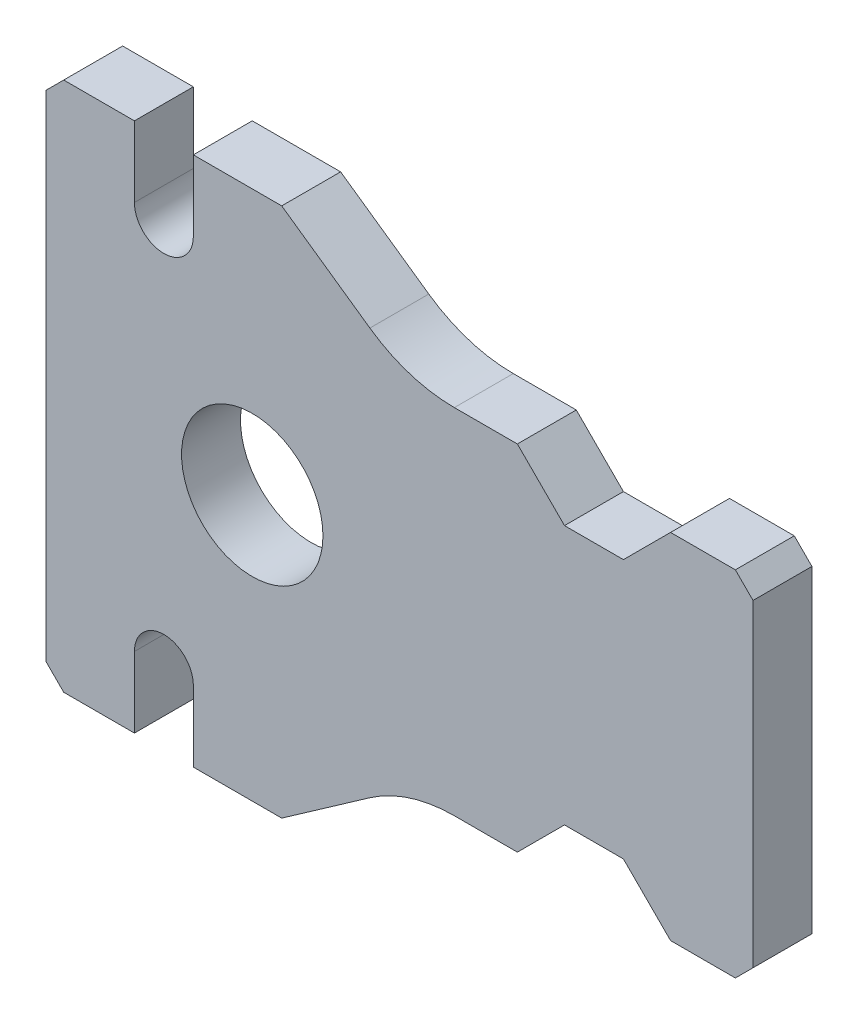
ISO-10303-21;
HEADER;
FILE_DESCRIPTION(('STEP AP214'),'2;1');
FILE_NAME('part.step','',(''),(''),'','','');
FILE_SCHEMA(('AUTOMOTIVE_DESIGN { 1 0 10303 214 1 1 1 1 }'));
ENDSEC;
DATA;
#1=APPLICATION_CONTEXT('core data for automotive mechanical design processes');
#2=APPLICATION_PROTOCOL_DEFINITION('international standard','automotive_design',2000,#1);
#3=PRODUCT_CONTEXT('',#1,'mechanical');
#4=PRODUCT('Part','Part','',(#3));
#5=PRODUCT_RELATED_PRODUCT_CATEGORY('part','',(#4));
#6=PRODUCT_DEFINITION_FORMATION('','',#4);
#7=PRODUCT_DEFINITION_CONTEXT('part definition',#1,'design');
#8=PRODUCT_DEFINITION('design','',#6,#7);
#9=PRODUCT_DEFINITION_SHAPE('','',#8);
#10=(LENGTH_UNIT() NAMED_UNIT(*) SI_UNIT(.MILLI.,.METRE.));
#11=(NAMED_UNIT(*) PLANE_ANGLE_UNIT() SI_UNIT($,.RADIAN.));
#12=(NAMED_UNIT(*) SI_UNIT($,.STERADIAN.) SOLID_ANGLE_UNIT());
#13=UNCERTAINTY_MEASURE_WITH_UNIT(LENGTH_MEASURE(1.E-05),#10,'distance_accuracy_value','');
#14=(GEOMETRIC_REPRESENTATION_CONTEXT(3) GLOBAL_UNCERTAINTY_ASSIGNED_CONTEXT((#13)) GLOBAL_UNIT_ASSIGNED_CONTEXT((#10,
#11,#12)) REPRESENTATION_CONTEXT('',''));
#15=CARTESIAN_POINT('',(0.,0.,0.));
#16=DIRECTION('',(0.,0.,1.));
#17=DIRECTION('',(1.,0.,0.));
#18=AXIS2_PLACEMENT_3D('',#15,#16,#17);
#19=CARTESIAN_POINT('',(-15.,-33.,10.));
#20=DIRECTION('',(0.,0.,1.));
#21=DIRECTION('',(1.,0.,0.));
#22=AXIS2_PLACEMENT_3D('',#19,#20,#21);
#23=PLANE('',#22);
#24=DIRECTION('',(1.,0.,0.));
#25=VECTOR('',#24,1.);
#26=CARTESIAN_POINT('',(85.,-30.,10.));
#27=LINE('',#26,#25);
#28=CARTESIAN_POINT('',(71.,-30.,10.));
#29=VERTEX_POINT('',#28);
#30=CARTESIAN_POINT('',(81.9999999999999,-30.,10.));
#31=VERTEX_POINT('',#30);
#32=EDGE_CURVE('E275',#29,#31,#27,.T.);
#33=ORIENTED_EDGE('',*,*,#32,.T.);
#34=DIRECTION('',(-0.707106781186551,-0.707106781186544,0.));
#35=VECTOR('',#34,1.);
#36=CARTESIAN_POINT('',(31.9999999999995,-80.,10.));
#37=LINE('',#36,#35);
#38=CARTESIAN_POINT('',(85.,-27.,10.));
#39=VERTEX_POINT('',#38);
#40=EDGE_CURVE('E41',#31,#39,#37,.F.);
#41=ORIENTED_EDGE('',*,*,#40,.T.);
#42=DIRECTION('',(0.,1.,0.));
#43=VECTOR('',#42,1.);
#44=CARTESIAN_POINT('',(85.,30.,10.));
#45=LINE('',#44,#43);
#46=CARTESIAN_POINT('',(85.,27.,10.));
#47=VERTEX_POINT('',#46);
#48=EDGE_CURVE('E274',#39,#47,#45,.T.);
#49=ORIENTED_EDGE('',*,*,#48,.T.);
#50=DIRECTION('',(0.707106781186544,-0.707106781186551,0.));
#51=VECTOR('',#50,1.);
#52=CARTESIAN_POINT('',(65.0000000000004,46.9999999999997,10.));
#53=LINE('',#52,#51);
#54=CARTESIAN_POINT('',(82.,30.,10.));
#55=VERTEX_POINT('',#54);
#56=EDGE_CURVE('E48',#47,#55,#53,.F.);
#57=ORIENTED_EDGE('',*,*,#56,.T.);
#58=DIRECTION('',(-1.,0.,0.));
#59=VECTOR('',#58,1.);
#60=CARTESIAN_POINT('',(85.,30.,10.));
#61=LINE('',#60,#59);
#62=CARTESIAN_POINT('',(71.,30.,10.));
#63=VERTEX_POINT('',#62);
#64=EDGE_CURVE('E283',#55,#63,#61,.T.);
#65=ORIENTED_EDGE('',*,*,#64,.T.);
#66=DIRECTION('',(-0.707106781186548,-0.707106781186547,0.));
#67=VECTOR('',#66,1.);
#68=CARTESIAN_POINT('',(63.,22.,10.));
#69=LINE('',#68,#67);
#70=CARTESIAN_POINT('',(63.,22.,10.));
#71=VERTEX_POINT('',#70);
#72=EDGE_CURVE('E445',#63,#71,#69,.T.);
#73=ORIENTED_EDGE('',*,*,#72,.T.);
#74=DIRECTION('',(-1.,0.,0.));
#75=VECTOR('',#74,1.);
#76=CARTESIAN_POINT('',(63.,22.,10.));
#77=LINE('',#76,#75);
#78=CARTESIAN_POINT('',(53.,22.,10.));
#79=VERTEX_POINT('',#78);
#80=EDGE_CURVE('E447',#71,#79,#77,.T.);
#81=ORIENTED_EDGE('',*,*,#80,.T.);
#82=DIRECTION('',(-0.707106781186548,0.707106781186548,0.));
#83=VECTOR('',#82,1.);
#84=CARTESIAN_POINT('',(53.,22.,10.));
#85=LINE('',#84,#83);
#86=CARTESIAN_POINT('',(45.,30.,10.));
#87=VERTEX_POINT('',#86);
#88=EDGE_CURVE('E449',#79,#87,#85,.T.);
#89=ORIENTED_EDGE('',*,*,#88,.T.);
#90=DIRECTION('',(-1.,0.,0.));
#91=VECTOR('',#90,1.);
#92=CARTESIAN_POINT('',(45.,30.,10.));
#93=LINE('',#92,#91);
#94=CARTESIAN_POINT('',(34.3046898231063,30.,10.));
#95=VERTEX_POINT('',#94);
#96=EDGE_CURVE('E451',#87,#95,#93,.T.);
#97=ORIENTED_EDGE('',*,*,#96,.T.);
#98=CARTESIAN_POINT('',(34.3046898231063,55.,10.));
#99=DIRECTION('',(0.,0.,-1.));
#100=DIRECTION('',(-1.,0.,0.));
#101=AXIS2_PLACEMENT_3D('',#98,#99,#100);
#102=CIRCLE('',#101,25.);
#103=CARTESIAN_POINT('',(19.96527891433,34.5211988927753,10.));
#104=VERTEX_POINT('',#103);
#105=EDGE_CURVE('E453',#95,#104,#102,.T.);
#106=ORIENTED_EDGE('',*,*,#105,.T.);
#107=DIRECTION('',(-0.819152044288991,0.573576436351047,0.));
#108=VECTOR('',#107,1.);
#109=CARTESIAN_POINT('',(5.,45.,10.));
#110=LINE('',#109,#108);
#111=CARTESIAN_POINT('',(5.,45.,10.));
#112=VERTEX_POINT('',#111);
#113=EDGE_CURVE('E455',#104,#112,#110,.T.);
#114=ORIENTED_EDGE('',*,*,#113,.T.);
#115=DIRECTION('',(-1.,0.,0.));
#116=VECTOR('',#115,1.);
#117=CARTESIAN_POINT('',(-10.,45.,10.));
#118=LINE('',#117,#116);
#119=CARTESIAN_POINT('',(-10.,45.,10.));
#120=VERTEX_POINT('',#119);
#121=EDGE_CURVE('E457',#112,#120,#118,.T.);
#122=ORIENTED_EDGE('',*,*,#121,.T.);
#123=DIRECTION('',(0.,-1.,0.));
#124=VECTOR('',#123,1.);
#125=CARTESIAN_POINT('',(-10.,33.,10.));
#126=LINE('',#125,#124);
#127=CARTESIAN_POINT('',(-10.,33.,10.));
#128=VERTEX_POINT('',#127);
#129=EDGE_CURVE('E459',#120,#128,#126,.T.);
#130=ORIENTED_EDGE('',*,*,#129,.T.);
#131=CARTESIAN_POINT('',(-15.,33.,10.));
#132=DIRECTION('',(0.,0.,-1.));
#133=DIRECTION('',(-1.,0.,0.));
#134=AXIS2_PLACEMENT_3D('',#131,#132,#133);
#135=CIRCLE('',#134,5.);
#136=CARTESIAN_POINT('',(-20.,33.,10.));
#137=VERTEX_POINT('',#136);
#138=EDGE_CURVE('E461',#128,#137,#135,.T.);
#139=ORIENTED_EDGE('',*,*,#138,.T.);
#140=DIRECTION('',(0.,1.,0.));
#141=VECTOR('',#140,1.);
#142=CARTESIAN_POINT('',(-20.,45.,10.));
#143=LINE('',#142,#141);
#144=CARTESIAN_POINT('',(-20.,45.,10.));
#145=VERTEX_POINT('',#144);
#146=EDGE_CURVE('E463',#137,#145,#143,.T.);
#147=ORIENTED_EDGE('',*,*,#146,.T.);
#148=DIRECTION('',(-1.,0.,0.));
#149=VECTOR('',#148,1.);
#150=CARTESIAN_POINT('',(-32.,45.,10.));
#151=LINE('',#150,#149);
#152=CARTESIAN_POINT('',(-32.,45.,10.));
#153=VERTEX_POINT('',#152);
#154=EDGE_CURVE('E465',#145,#153,#151,.T.);
#155=ORIENTED_EDGE('',*,*,#154,.T.);
#156=DIRECTION('',(-0.707106781186547,-0.707106781186547,0.));
#157=VECTOR('',#156,1.);
#158=CARTESIAN_POINT('',(-35.,42.,10.));
#159=LINE('',#158,#157);
#160=CARTESIAN_POINT('',(-35.,42.,10.));
#161=VERTEX_POINT('',#160);
#162=EDGE_CURVE('E467',#153,#161,#159,.T.);
#163=ORIENTED_EDGE('',*,*,#162,.T.);
#164=DIRECTION('',(0.,-1.,0.));
#165=VECTOR('',#164,1.);
#166=CARTESIAN_POINT('',(-35.,42.,10.));
#167=LINE('',#166,#165);
#168=CARTESIAN_POINT('',(-35.,-42.,10.));
#169=VERTEX_POINT('',#168);
#170=EDGE_CURVE('E469',#161,#169,#167,.T.);
#171=ORIENTED_EDGE('',*,*,#170,.T.);
#172=DIRECTION('',(0.707106781186547,-0.707106781186547,0.));
#173=VECTOR('',#172,1.);
#174=CARTESIAN_POINT('',(-35.,-42.,10.));
#175=LINE('',#174,#173);
#176=CARTESIAN_POINT('',(-32.,-45.,10.));
#177=VERTEX_POINT('',#176);
#178=EDGE_CURVE('E471',#169,#177,#175,.T.);
#179=ORIENTED_EDGE('',*,*,#178,.T.);
#180=DIRECTION('',(1.,0.,0.));
#181=VECTOR('',#180,1.);
#182=CARTESIAN_POINT('',(-32.,-45.,10.));
#183=LINE('',#182,#181);
#184=CARTESIAN_POINT('',(-20.,-45.,10.));
#185=VERTEX_POINT('',#184);
#186=EDGE_CURVE('E248',#177,#185,#183,.T.);
#187=ORIENTED_EDGE('',*,*,#186,.T.);
#188=DIRECTION('',(0.,1.,0.));
#189=VECTOR('',#188,1.);
#190=CARTESIAN_POINT('',(-20.,-45.,10.));
#191=LINE('',#190,#189);
#192=CARTESIAN_POINT('',(-20.,-33.,10.));
#193=VERTEX_POINT('',#192);
#194=EDGE_CURVE('E243',#185,#193,#191,.T.);
#195=ORIENTED_EDGE('',*,*,#194,.T.);
#196=CARTESIAN_POINT('',(-15.,-33.,10.));
#197=DIRECTION('',(0.,0.,-1.));
#198=DIRECTION('',(1.,0.,0.));
#199=AXIS2_PLACEMENT_3D('',#196,#197,#198);
#200=CIRCLE('',#199,5.);
#201=CARTESIAN_POINT('',(-10.,-33.,10.));
#202=VERTEX_POINT('',#201);
#203=EDGE_CURVE('E233',#193,#202,#200,.T.);
#204=ORIENTED_EDGE('',*,*,#203,.T.);
#205=DIRECTION('',(0.,-1.,0.));
#206=VECTOR('',#205,1.);
#207=CARTESIAN_POINT('',(-10.,-33.,10.));
#208=LINE('',#207,#206);
#209=CARTESIAN_POINT('',(-10.,-45.,10.));
#210=VERTEX_POINT('',#209);
#211=EDGE_CURVE('E242',#202,#210,#208,.T.);
#212=ORIENTED_EDGE('',*,*,#211,.T.);
#213=DIRECTION('',(1.,0.,0.));
#214=VECTOR('',#213,1.);
#215=CARTESIAN_POINT('',(-10.,-45.,10.));
#216=LINE('',#215,#214);
#217=CARTESIAN_POINT('',(5.,-45.,10.));
#218=VERTEX_POINT('',#217);
#219=EDGE_CURVE('E408',#210,#218,#216,.T.);
#220=ORIENTED_EDGE('',*,*,#219,.T.);
#221=DIRECTION('',(0.819152044288991,0.573576436351047,0.));
#222=VECTOR('',#221,1.);
#223=CARTESIAN_POINT('',(5.,-45.,10.));
#224=LINE('',#223,#222);
#225=CARTESIAN_POINT('',(19.96527891433,-34.5211988927753,10.));
#226=VERTEX_POINT('',#225);
#227=EDGE_CURVE('E477',#218,#226,#224,.T.);
#228=ORIENTED_EDGE('',*,*,#227,.T.);
#229=CARTESIAN_POINT('',(34.3046898231063,-55.,10.));
#230=DIRECTION('',(0.,0.,-1.));
#231=DIRECTION('',(1.,0.,0.));
#232=AXIS2_PLACEMENT_3D('',#229,#230,#231);
#233=CIRCLE('',#232,25.);
#234=CARTESIAN_POINT('',(34.3046898231063,-30.,10.));
#235=VERTEX_POINT('',#234);
#236=EDGE_CURVE('E481',#226,#235,#233,.T.);
#237=ORIENTED_EDGE('',*,*,#236,.T.);
#238=DIRECTION('',(1.,0.,0.));
#239=VECTOR('',#238,1.);
#240=CARTESIAN_POINT('',(45.,-30.,10.));
#241=LINE('',#240,#239);
#242=CARTESIAN_POINT('',(45.,-30.,10.));
#243=VERTEX_POINT('',#242);
#244=EDGE_CURVE('E483',#235,#243,#241,.T.);
#245=ORIENTED_EDGE('',*,*,#244,.T.);
#246=DIRECTION('',(0.707106781186548,0.707106781186548,0.));
#247=VECTOR('',#246,1.);
#248=CARTESIAN_POINT('',(53.,-22.,10.));
#249=LINE('',#248,#247);
#250=CARTESIAN_POINT('',(53.,-22.,10.));
#251=VERTEX_POINT('',#250);
#252=EDGE_CURVE('E440',#243,#251,#249,.T.);
#253=ORIENTED_EDGE('',*,*,#252,.T.);
#254=DIRECTION('',(1.,0.,0.));
#255=VECTOR('',#254,1.);
#256=CARTESIAN_POINT('',(63.,-22.,10.));
#257=LINE('',#256,#255);
#258=CARTESIAN_POINT('',(63.,-22.,10.));
#259=VERTEX_POINT('',#258);
#260=EDGE_CURVE('E437',#251,#259,#257,.T.);
#261=ORIENTED_EDGE('',*,*,#260,.T.);
#262=DIRECTION('',(0.707106781186548,-0.707106781186547,0.));
#263=VECTOR('',#262,1.);
#264=CARTESIAN_POINT('',(63.,-22.,10.));
#265=LINE('',#264,#263);
#266=EDGE_CURVE('E436',#259,#29,#265,.T.);
#267=ORIENTED_EDGE('',*,*,#266,.T.);
#268=EDGE_LOOP('',(#33,#41,#49,#57,#65,#73,#81,#89,#97,#106,#114,#122,#130,#139,#147,#155,#163,
#171,#179,#187,#195,#204,#212,#220,#228,#237,#245,#253,#261,#267));
#269=FACE_BOUND('',#268,.T.);
#270=CARTESIAN_POINT('',(0.,0.,10.));
#271=DIRECTION('',(0.,0.,1.));
#272=DIRECTION('',(1.,0.,0.));
#273=AXIS2_PLACEMENT_3D('',#270,#271,#272);
#274=CIRCLE('',#273,12.);
#275=CARTESIAN_POINT('',(12.,0.,10.));
#276=VERTEX_POINT('',#275);
#277=EDGE_CURVE('E474',#276,#276,#274,.T.);
#278=ORIENTED_EDGE('',*,*,#277,.F.);
#279=EDGE_LOOP('',(#278));
#280=FACE_BOUND('',#279,.T.);
#281=ADVANCED_FACE('F33',(#269,#280),#23,.T.);
#282=CARTESIAN_POINT('',(-15.,-33.,0.));
#283=DIRECTION('',(0.,0.,1.));
#284=DIRECTION('',(1.,0.,0.));
#285=AXIS2_PLACEMENT_3D('',#282,#283,#284);
#286=PLANE('',#285);
#287=DIRECTION('',(0.,1.,0.));
#288=VECTOR('',#287,1.);
#289=CARTESIAN_POINT('',(85.,30.,0.));
#290=LINE('',#289,#288);
#291=CARTESIAN_POINT('',(85.,-27.,0.));
#292=VERTEX_POINT('',#291);
#293=CARTESIAN_POINT('',(85.,27.,0.));
#294=VERTEX_POINT('',#293);
#295=EDGE_CURVE('E292',#292,#294,#290,.T.);
#296=ORIENTED_EDGE('',*,*,#295,.F.);
#297=DIRECTION('',(0.707106781186551,0.707106781186544,0.));
#298=VECTOR('',#297,1.);
#299=CARTESIAN_POINT('',(85.,-27.,0.));
#300=LINE('',#299,#298);
#301=CARTESIAN_POINT('',(81.9999999999999,-30.,0.));
#302=VERTEX_POINT('',#301);
#303=EDGE_CURVE('E269',#292,#302,#300,.F.);
#304=ORIENTED_EDGE('',*,*,#303,.T.);
#305=DIRECTION('',(1.,0.,0.));
#306=VECTOR('',#305,1.);
#307=CARTESIAN_POINT('',(85.,-30.,0.));
#308=LINE('',#307,#306);
#309=CARTESIAN_POINT('',(71.,-30.,0.));
#310=VERTEX_POINT('',#309);
#311=EDGE_CURVE('E291',#310,#302,#308,.T.);
#312=ORIENTED_EDGE('',*,*,#311,.F.);
#313=DIRECTION('',(0.707106781186548,-0.707106781186547,0.));
#314=VECTOR('',#313,1.);
#315=CARTESIAN_POINT('',(63.,-22.,0.));
#316=LINE('',#315,#314);
#317=CARTESIAN_POINT('',(63.,-22.,0.));
#318=VERTEX_POINT('',#317);
#319=EDGE_CURVE('E297',#318,#310,#316,.T.);
#320=ORIENTED_EDGE('',*,*,#319,.F.);
#321=DIRECTION('',(1.,0.,0.));
#322=VECTOR('',#321,1.);
#323=CARTESIAN_POINT('',(63.,-22.,0.));
#324=LINE('',#323,#322);
#325=CARTESIAN_POINT('',(53.,-22.,0.));
#326=VERTEX_POINT('',#325);
#327=EDGE_CURVE('E301',#326,#318,#324,.T.);
#328=ORIENTED_EDGE('',*,*,#327,.F.);
#329=DIRECTION('',(0.707106781186548,0.707106781186548,0.));
#330=VECTOR('',#329,1.);
#331=CARTESIAN_POINT('',(53.,-22.,0.));
#332=LINE('',#331,#330);
#333=CARTESIAN_POINT('',(45.,-30.,0.));
#334=VERTEX_POINT('',#333);
#335=EDGE_CURVE('E425',#334,#326,#332,.T.);
#336=ORIENTED_EDGE('',*,*,#335,.F.);
#337=DIRECTION('',(1.,0.,0.));
#338=VECTOR('',#337,1.);
#339=CARTESIAN_POINT('',(45.,-30.,0.));
#340=LINE('',#339,#338);
#341=CARTESIAN_POINT('',(34.3046898231063,-30.,0.));
#342=VERTEX_POINT('',#341);
#343=EDGE_CURVE('E423',#342,#334,#340,.T.);
#344=ORIENTED_EDGE('',*,*,#343,.F.);
#345=CARTESIAN_POINT('',(34.3046898231063,-55.,0.));
#346=DIRECTION('',(0.,0.,-1.));
#347=DIRECTION('',(1.,0.,0.));
#348=AXIS2_PLACEMENT_3D('',#345,#346,#347);
#349=CIRCLE('',#348,25.);
#350=CARTESIAN_POINT('',(19.96527891433,-34.5211988927753,0.));
#351=VERTEX_POINT('',#350);
#352=EDGE_CURVE('E416',#351,#342,#349,.T.);
#353=ORIENTED_EDGE('',*,*,#352,.F.);
#354=DIRECTION('',(0.819152044288991,0.573576436351047,0.));
#355=VECTOR('',#354,1.);
#356=CARTESIAN_POINT('',(5.,-45.,0.));
#357=LINE('',#356,#355);
#358=CARTESIAN_POINT('',(5.,-45.,0.));
#359=VERTEX_POINT('',#358);
#360=EDGE_CURVE('E414',#359,#351,#357,.T.);
#361=ORIENTED_EDGE('',*,*,#360,.F.);
#362=DIRECTION('',(1.,0.,0.));
#363=VECTOR('',#362,1.);
#364=CARTESIAN_POINT('',(-10.,-45.,0.));
#365=LINE('',#364,#363);
#366=CARTESIAN_POINT('',(-10.,-45.,0.));
#367=VERTEX_POINT('',#366);
#368=EDGE_CURVE('E407',#367,#359,#365,.T.);
#369=ORIENTED_EDGE('',*,*,#368,.F.);
#370=DIRECTION('',(0.,-1.,0.));
#371=VECTOR('',#370,1.);
#372=CARTESIAN_POINT('',(-10.,-33.,0.));
#373=LINE('',#372,#371);
#374=CARTESIAN_POINT('',(-10.,-33.,0.));
#375=VERTEX_POINT('',#374);
#376=EDGE_CURVE('E412',#375,#367,#373,.T.);
#377=ORIENTED_EDGE('',*,*,#376,.F.);
#378=CARTESIAN_POINT('',(-15.,-33.,0.));
#379=DIRECTION('',(0.,0.,-1.));
#380=DIRECTION('',(1.,0.,0.));
#381=AXIS2_PLACEMENT_3D('',#378,#379,#380);
#382=CIRCLE('',#381,5.);
#383=CARTESIAN_POINT('',(-20.,-33.,0.));
#384=VERTEX_POINT('',#383);
#385=EDGE_CURVE('E418',#384,#375,#382,.T.);
#386=ORIENTED_EDGE('',*,*,#385,.F.);
#387=DIRECTION('',(0.,1.,0.));
#388=VECTOR('',#387,1.);
#389=CARTESIAN_POINT('',(-20.,-45.,0.));
#390=LINE('',#389,#388);
#391=CARTESIAN_POINT('',(-20.,-45.,0.));
#392=VERTEX_POINT('',#391);
#393=EDGE_CURVE('E256',#392,#384,#390,.T.);
#394=ORIENTED_EDGE('',*,*,#393,.F.);
#395=DIRECTION('',(1.,0.,0.));
#396=VECTOR('',#395,1.);
#397=CARTESIAN_POINT('',(-32.,-45.,0.));
#398=LINE('',#397,#396);
#399=CARTESIAN_POINT('',(-32.,-45.,0.));
#400=VERTEX_POINT('',#399);
#401=EDGE_CURVE('E252',#400,#392,#398,.T.);
#402=ORIENTED_EDGE('',*,*,#401,.F.);
#403=DIRECTION('',(0.707106781186547,-0.707106781186547,0.));
#404=VECTOR('',#403,1.);
#405=CARTESIAN_POINT('',(-35.,-42.,0.));
#406=LINE('',#405,#404);
#407=CARTESIAN_POINT('',(-35.,-42.,0.));
#408=VERTEX_POINT('',#407);
#409=EDGE_CURVE('E332',#408,#400,#406,.T.);
#410=ORIENTED_EDGE('',*,*,#409,.F.);
#411=DIRECTION('',(0.,-1.,0.));
#412=VECTOR('',#411,1.);
#413=CARTESIAN_POINT('',(-35.,42.,0.));
#414=LINE('',#413,#412);
#415=CARTESIAN_POINT('',(-35.,42.,0.));
#416=VERTEX_POINT('',#415);
#417=EDGE_CURVE('E330',#416,#408,#414,.T.);
#418=ORIENTED_EDGE('',*,*,#417,.F.);
#419=DIRECTION('',(-0.707106781186547,-0.707106781186547,0.));
#420=VECTOR('',#419,1.);
#421=CARTESIAN_POINT('',(-35.,42.,0.));
#422=LINE('',#421,#420);
#423=CARTESIAN_POINT('',(-32.,45.,0.));
#424=VERTEX_POINT('',#423);
#425=EDGE_CURVE('E328',#424,#416,#422,.T.);
#426=ORIENTED_EDGE('',*,*,#425,.F.);
#427=DIRECTION('',(-1.,0.,0.));
#428=VECTOR('',#427,1.);
#429=CARTESIAN_POINT('',(-32.,45.,0.));
#430=LINE('',#429,#428);
#431=CARTESIAN_POINT('',(-20.,45.,0.));
#432=VERTEX_POINT('',#431);
#433=EDGE_CURVE('E326',#432,#424,#430,.T.);
#434=ORIENTED_EDGE('',*,*,#433,.F.);
#435=DIRECTION('',(0.,1.,0.));
#436=VECTOR('',#435,1.);
#437=CARTESIAN_POINT('',(-20.,45.,0.));
#438=LINE('',#437,#436);
#439=CARTESIAN_POINT('',(-20.,33.,0.));
#440=VERTEX_POINT('',#439);
#441=EDGE_CURVE('E324',#440,#432,#438,.T.);
#442=ORIENTED_EDGE('',*,*,#441,.F.);
#443=CARTESIAN_POINT('',(-15.,33.,0.));
#444=DIRECTION('',(0.,0.,-1.));
#445=DIRECTION('',(-1.,0.,0.));
#446=AXIS2_PLACEMENT_3D('',#443,#444,#445);
#447=CIRCLE('',#446,5.);
#448=CARTESIAN_POINT('',(-10.,33.,0.));
#449=VERTEX_POINT('',#448);
#450=EDGE_CURVE('E322',#449,#440,#447,.T.);
#451=ORIENTED_EDGE('',*,*,#450,.F.);
#452=DIRECTION('',(0.,-1.,0.));
#453=VECTOR('',#452,1.);
#454=CARTESIAN_POINT('',(-10.,33.,0.));
#455=LINE('',#454,#453);
#456=CARTESIAN_POINT('',(-10.,45.,0.));
#457=VERTEX_POINT('',#456);
#458=EDGE_CURVE('E320',#457,#449,#455,.T.);
#459=ORIENTED_EDGE('',*,*,#458,.F.);
#460=DIRECTION('',(-1.,0.,0.));
#461=VECTOR('',#460,1.);
#462=CARTESIAN_POINT('',(-10.,45.,0.));
#463=LINE('',#462,#461);
#464=CARTESIAN_POINT('',(5.,45.,0.));
#465=VERTEX_POINT('',#464);
#466=EDGE_CURVE('E318',#465,#457,#463,.T.);
#467=ORIENTED_EDGE('',*,*,#466,.F.);
#468=DIRECTION('',(-0.819152044288991,0.573576436351047,0.));
#469=VECTOR('',#468,1.);
#470=CARTESIAN_POINT('',(5.,45.,0.));
#471=LINE('',#470,#469);
#472=CARTESIAN_POINT('',(19.96527891433,34.5211988927753,0.));
#473=VERTEX_POINT('',#472);
#474=EDGE_CURVE('E316',#473,#465,#471,.T.);
#475=ORIENTED_EDGE('',*,*,#474,.F.);
#476=CARTESIAN_POINT('',(34.3046898231063,55.,0.));
#477=DIRECTION('',(0.,0.,-1.));
#478=DIRECTION('',(-1.,0.,0.));
#479=AXIS2_PLACEMENT_3D('',#476,#477,#478);
#480=CIRCLE('',#479,25.);
#481=CARTESIAN_POINT('',(34.3046898231063,30.,0.));
#482=VERTEX_POINT('',#481);
#483=EDGE_CURVE('E314',#482,#473,#480,.T.);
#484=ORIENTED_EDGE('',*,*,#483,.F.);
#485=DIRECTION('',(-1.,0.,0.));
#486=VECTOR('',#485,1.);
#487=CARTESIAN_POINT('',(45.,30.,0.));
#488=LINE('',#487,#486);
#489=CARTESIAN_POINT('',(45.,30.,0.));
#490=VERTEX_POINT('',#489);
#491=EDGE_CURVE('E312',#490,#482,#488,.T.);
#492=ORIENTED_EDGE('',*,*,#491,.F.);
#493=DIRECTION('',(-0.707106781186548,0.707106781186548,0.));
#494=VECTOR('',#493,1.);
#495=CARTESIAN_POINT('',(53.,22.,0.));
#496=LINE('',#495,#494);
#497=CARTESIAN_POINT('',(53.,22.,0.));
#498=VERTEX_POINT('',#497);
#499=EDGE_CURVE('E310',#498,#490,#496,.T.);
#500=ORIENTED_EDGE('',*,*,#499,.F.);
#501=DIRECTION('',(-1.,0.,0.));
#502=VECTOR('',#501,1.);
#503=CARTESIAN_POINT('',(63.,22.,0.));
#504=LINE('',#503,#502);
#505=CARTESIAN_POINT('',(63.,22.,0.));
#506=VERTEX_POINT('',#505);
#507=EDGE_CURVE('E308',#506,#498,#504,.T.);
#508=ORIENTED_EDGE('',*,*,#507,.F.);
#509=DIRECTION('',(-0.707106781186548,-0.707106781186547,0.));
#510=VECTOR('',#509,1.);
#511=CARTESIAN_POINT('',(63.,22.,0.));
#512=LINE('',#511,#510);
#513=CARTESIAN_POINT('',(71.,30.,0.));
#514=VERTEX_POINT('',#513);
#515=EDGE_CURVE('E306',#514,#506,#512,.T.);
#516=ORIENTED_EDGE('',*,*,#515,.F.);
#517=DIRECTION('',(-1.,0.,0.));
#518=VECTOR('',#517,1.);
#519=CARTESIAN_POINT('',(85.,30.,0.));
#520=LINE('',#519,#518);
#521=CARTESIAN_POINT('',(82.,30.,0.));
#522=VERTEX_POINT('',#521);
#523=EDGE_CURVE('E299',#522,#514,#520,.T.);
#524=ORIENTED_EDGE('',*,*,#523,.F.);
#525=DIRECTION('',(-0.707106781186544,0.707106781186551,0.));
#526=VECTOR('',#525,1.);
#527=CARTESIAN_POINT('',(82.,30.,0.));
#528=LINE('',#527,#526);
#529=EDGE_CURVE('E267',#522,#294,#528,.F.);
#530=ORIENTED_EDGE('',*,*,#529,.T.);
#531=EDGE_LOOP('',(#296,#304,#312,#320,#328,#336,#344,#353,#361,#369,#377,#386,#394,#402,#410,
#418,#426,#434,#442,#451,#459,#467,#475,#484,#492,#500,#508,#516,#524,#530));
#532=FACE_BOUND('',#531,.T.);
#533=CARTESIAN_POINT('',(0.,0.,0.));
#534=DIRECTION('',(0.,0.,1.));
#535=DIRECTION('',(1.,0.,0.));
#536=AXIS2_PLACEMENT_3D('',#533,#534,#535);
#537=CIRCLE('',#536,12.);
#538=CARTESIAN_POINT('',(12.,0.,0.));
#539=VERTEX_POINT('',#538);
#540=EDGE_CURVE('E848',#539,#539,#537,.T.);
#541=ORIENTED_EDGE('',*,*,#540,.T.);
#542=EDGE_LOOP('',(#541));
#543=FACE_BOUND('',#542,.T.);
#544=ADVANCED_FACE('F288',(#532,#543),#286,.F.);
#545=CARTESIAN_POINT('',(-20.,-45.,10.));
#546=DIRECTION('',(-1.,0.,0.));
#547=DIRECTION('',(0.,0.,1.));
#548=AXIS2_PLACEMENT_3D('',#545,#546,#547);
#549=PLANE('',#548);
#550=ORIENTED_EDGE('',*,*,#393,.T.);
#551=DIRECTION('',(0.,0.,-1.));
#552=VECTOR('',#551,1.);
#553=CARTESIAN_POINT('',(-20.,-33.,10.));
#554=LINE('',#553,#552);
#555=EDGE_CURVE('E237',#193,#384,#554,.T.);
#556=ORIENTED_EDGE('',*,*,#555,.F.);
#557=ORIENTED_EDGE('',*,*,#194,.F.);
#558=DIRECTION('',(0.,0.,-1.));
#559=VECTOR('',#558,1.);
#560=CARTESIAN_POINT('',(-20.,-45.,10.));
#561=LINE('',#560,#559);
#562=EDGE_CURVE('E335',#185,#392,#561,.T.);
#563=ORIENTED_EDGE('',*,*,#562,.T.);
#564=EDGE_LOOP('',(#550,#556,#557,#563));
#565=FACE_BOUND('',#564,.T.);
#566=ADVANCED_FACE('F254',(#565),#549,.F.);
#567=CARTESIAN_POINT('',(-15.,-33.,10.));
#568=DIRECTION('',(0.,0.,-1.));
#569=DIRECTION('',(-1.,0.,0.));
#570=AXIS2_PLACEMENT_3D('',#567,#568,#569);
#571=CYLINDRICAL_SURFACE('',#570,5.);
#572=ORIENTED_EDGE('',*,*,#385,.T.);
#573=DIRECTION('',(0.,0.,-1.));
#574=VECTOR('',#573,1.);
#575=CARTESIAN_POINT('',(-10.,-33.,10.));
#576=LINE('',#575,#574);
#577=EDGE_CURVE('E240',#202,#375,#576,.T.);
#578=ORIENTED_EDGE('',*,*,#577,.F.);
#579=ORIENTED_EDGE('',*,*,#203,.F.);
#580=ORIENTED_EDGE('',*,*,#555,.T.);
#581=EDGE_LOOP('',(#572,#578,#579,#580));
#582=FACE_BOUND('',#581,.T.);
#583=ADVANCED_FACE('F235',(#582),#571,.F.);
#584=CARTESIAN_POINT('',(-10.,-33.,10.));
#585=DIRECTION('',(1.,0.,0.));
#586=DIRECTION('',(0.,0.,-1.));
#587=AXIS2_PLACEMENT_3D('',#584,#585,#586);
#588=PLANE('',#587);
#589=ORIENTED_EDGE('',*,*,#376,.T.);
#590=DIRECTION('',(0.,0.,-1.));
#591=VECTOR('',#590,1.);
#592=CARTESIAN_POINT('',(-10.,-45.,10.));
#593=LINE('',#592,#591);
#594=EDGE_CURVE('E261',#210,#367,#593,.T.);
#595=ORIENTED_EDGE('',*,*,#594,.F.);
#596=ORIENTED_EDGE('',*,*,#211,.F.);
#597=ORIENTED_EDGE('',*,*,#577,.T.);
#598=EDGE_LOOP('',(#589,#595,#596,#597));
#599=FACE_BOUND('',#598,.T.);
#600=ADVANCED_FACE('F475',(#599),#588,.F.);
#601=CARTESIAN_POINT('',(-10.,-45.,10.));
#602=DIRECTION('',(0.,1.,0.));
#603=DIRECTION('',(0.,0.,1.));
#604=AXIS2_PLACEMENT_3D('',#601,#602,#603);
#605=PLANE('',#604);
#606=ORIENTED_EDGE('',*,*,#368,.T.);
#607=DIRECTION('',(0.,0.,-1.));
#608=VECTOR('',#607,1.);
#609=CARTESIAN_POINT('',(5.,-45.,10.));
#610=LINE('',#609,#608);
#611=EDGE_CURVE('E398',#218,#359,#610,.T.);
#612=ORIENTED_EDGE('',*,*,#611,.F.);
#613=ORIENTED_EDGE('',*,*,#219,.F.);
#614=ORIENTED_EDGE('',*,*,#594,.T.);
#615=EDGE_LOOP('',(#606,#612,#613,#614));
#616=FACE_BOUND('',#615,.T.);
#617=ADVANCED_FACE('F405',(#616),#605,.F.);
#618=CARTESIAN_POINT('',(5.,-45.,10.));
#619=DIRECTION('',(-0.573576436351047,0.819152044288991,0.));
#620=DIRECTION('',(-0.819152044288991,-0.573576436351047,0.));
#621=AXIS2_PLACEMENT_3D('',#618,#619,#620);
#622=PLANE('',#621);
#623=ORIENTED_EDGE('',*,*,#360,.T.);
#624=DIRECTION('',(0.,0.,-1.));
#625=VECTOR('',#624,1.);
#626=CARTESIAN_POINT('',(19.96527891433,-34.5211988927753,10.));
#627=LINE('',#626,#625);
#628=EDGE_CURVE('E395',#226,#351,#627,.T.);
#629=ORIENTED_EDGE('',*,*,#628,.F.);
#630=ORIENTED_EDGE('',*,*,#227,.F.);
#631=ORIENTED_EDGE('',*,*,#611,.T.);
#632=EDGE_LOOP('',(#623,#629,#630,#631));
#633=FACE_BOUND('',#632,.T.);
#634=ADVANCED_FACE('F499',(#633),#622,.F.);
#635=CARTESIAN_POINT('',(34.3046898231063,-55.,10.));
#636=DIRECTION('',(0.,0.,-1.));
#637=DIRECTION('',(-1.,0.,0.));
#638=AXIS2_PLACEMENT_3D('',#635,#636,#637);
#639=CYLINDRICAL_SURFACE('',#638,25.);
#640=ORIENTED_EDGE('',*,*,#352,.T.);
#641=DIRECTION('',(0.,0.,-1.));
#642=VECTOR('',#641,1.);
#643=CARTESIAN_POINT('',(34.3046898231063,-30.,10.));
#644=LINE('',#643,#642);
#645=EDGE_CURVE('E392',#235,#342,#644,.T.);
#646=ORIENTED_EDGE('',*,*,#645,.F.);
#647=ORIENTED_EDGE('',*,*,#236,.F.);
#648=ORIENTED_EDGE('',*,*,#628,.T.);
#649=EDGE_LOOP('',(#640,#646,#647,#648));
#650=FACE_BOUND('',#649,.T.);
#651=ADVANCED_FACE('F495',(#650),#639,.F.);
#652=CARTESIAN_POINT('',(45.,-30.,10.));
#653=DIRECTION('',(0.,1.,0.));
#654=DIRECTION('',(-1.,0.,0.));
#655=AXIS2_PLACEMENT_3D('',#652,#653,#654);
#656=PLANE('',#655);
#657=ORIENTED_EDGE('',*,*,#343,.T.);
#658=DIRECTION('',(0.,0.,-1.));
#659=VECTOR('',#658,1.);
#660=CARTESIAN_POINT('',(45.,-30.,10.));
#661=LINE('',#660,#659);
#662=EDGE_CURVE('E389',#243,#334,#661,.T.);
#663=ORIENTED_EDGE('',*,*,#662,.F.);
#664=ORIENTED_EDGE('',*,*,#244,.F.);
#665=ORIENTED_EDGE('',*,*,#645,.T.);
#666=EDGE_LOOP('',(#657,#663,#664,#665));
#667=FACE_BOUND('',#666,.T.);
#668=ADVANCED_FACE('F491',(#667),#656,.F.);
#669=CARTESIAN_POINT('',(53.,-22.,10.));
#670=DIRECTION('',(-0.707106781186548,0.707106781186548,0.));
#671=DIRECTION('',(-0.707106781186548,-0.707106781186548,0.));
#672=AXIS2_PLACEMENT_3D('',#669,#670,#671);
#673=PLANE('',#672);
#674=ORIENTED_EDGE('',*,*,#335,.T.);
#675=DIRECTION('',(0.,0.,-1.));
#676=VECTOR('',#675,1.);
#677=CARTESIAN_POINT('',(53.,-22.,10.));
#678=LINE('',#677,#676);
#679=EDGE_CURVE('E386',#251,#326,#678,.T.);
#680=ORIENTED_EDGE('',*,*,#679,.F.);
#681=ORIENTED_EDGE('',*,*,#252,.F.);
#682=ORIENTED_EDGE('',*,*,#662,.T.);
#683=EDGE_LOOP('',(#674,#680,#681,#682));
#684=FACE_BOUND('',#683,.T.);
#685=ADVANCED_FACE('F488',(#684),#673,.F.);
#686=CARTESIAN_POINT('',(63.,-22.,10.));
#687=DIRECTION('',(0.,1.,0.));
#688=DIRECTION('',(0.,0.,1.));
#689=AXIS2_PLACEMENT_3D('',#686,#687,#688);
#690=PLANE('',#689);
#691=ORIENTED_EDGE('',*,*,#327,.T.);
#692=DIRECTION('',(0.,0.,-1.));
#693=VECTOR('',#692,1.);
#694=CARTESIAN_POINT('',(63.,-22.,10.));
#695=LINE('',#694,#693);
#696=EDGE_CURVE('E383',#259,#318,#695,.T.);
#697=ORIENTED_EDGE('',*,*,#696,.F.);
#698=ORIENTED_EDGE('',*,*,#260,.F.);
#699=ORIENTED_EDGE('',*,*,#679,.T.);
#700=EDGE_LOOP('',(#691,#697,#698,#699));
#701=FACE_BOUND('',#700,.T.);
#702=ADVANCED_FACE('F429',(#701),#690,.F.);
#703=CARTESIAN_POINT('',(63.,-22.,10.));
#704=DIRECTION('',(0.707106781186547,0.707106781186548,0.));
#705=DIRECTION('',(-0.707106781186548,0.707106781186547,0.));
#706=AXIS2_PLACEMENT_3D('',#703,#704,#705);
#707=PLANE('',#706);
#708=ORIENTED_EDGE('',*,*,#319,.T.);
#709=DIRECTION('',(0.,0.,-1.));
#710=VECTOR('',#709,1.);
#711=CARTESIAN_POINT('',(71.,-30.,10.));
#712=LINE('',#711,#710);
#713=EDGE_CURVE('E296',#29,#310,#712,.T.);
#714=ORIENTED_EDGE('',*,*,#713,.F.);
#715=ORIENTED_EDGE('',*,*,#266,.F.);
#716=ORIENTED_EDGE('',*,*,#696,.T.);
#717=EDGE_LOOP('',(#708,#714,#715,#716));
#718=FACE_BOUND('',#717,.T.);
#719=ADVANCED_FACE('F435',(#718),#707,.F.);
#720=CARTESIAN_POINT('',(85.,-30.,10.));
#721=DIRECTION('',(0.,1.,0.));
#722=DIRECTION('',(-1.,0.,0.));
#723=AXIS2_PLACEMENT_3D('',#720,#721,#722);
#724=PLANE('',#723);
#725=ORIENTED_EDGE('',*,*,#311,.T.);
#726=DIRECTION('',(0.,0.,1.));
#727=VECTOR('',#726,1.);
#728=CARTESIAN_POINT('',(81.9999999999999,-30.,10.));
#729=LINE('',#728,#727);
#730=EDGE_CURVE('E56',#302,#31,#729,.T.);
#731=ORIENTED_EDGE('',*,*,#730,.T.);
#732=ORIENTED_EDGE('',*,*,#32,.F.);
#733=ORIENTED_EDGE('',*,*,#713,.T.);
#734=EDGE_LOOP('',(#725,#731,#732,#733));
#735=FACE_BOUND('',#734,.T.);
#736=ADVANCED_FACE('F294',(#735),#724,.F.);
#737=CARTESIAN_POINT('',(85.,30.,10.));
#738=DIRECTION('',(-1.,0.,0.));
#739=DIRECTION('',(0.,0.,1.));
#740=AXIS2_PLACEMENT_3D('',#737,#738,#739);
#741=PLANE('',#740);
#742=ORIENTED_EDGE('',*,*,#48,.F.);
#743=DIRECTION('',(0.,0.,-1.));
#744=VECTOR('',#743,1.);
#745=CARTESIAN_POINT('',(85.,-27.,10.));
#746=LINE('',#745,#744);
#747=EDGE_CURVE('E259',#39,#292,#746,.T.);
#748=ORIENTED_EDGE('',*,*,#747,.T.);
#749=ORIENTED_EDGE('',*,*,#295,.T.);
#750=DIRECTION('',(0.,0.,1.));
#751=VECTOR('',#750,1.);
#752=CARTESIAN_POINT('',(85.,27.,10.));
#753=LINE('',#752,#751);
#754=EDGE_CURVE('E257',#294,#47,#753,.T.);
#755=ORIENTED_EDGE('',*,*,#754,.T.);
#756=EDGE_LOOP('',(#742,#748,#749,#755));
#757=FACE_BOUND('',#756,.T.);
#758=ADVANCED_FACE('F279',(#757),#741,.F.);
#759=CARTESIAN_POINT('',(85.,30.,10.));
#760=DIRECTION('',(0.,-1.,0.));
#761=DIRECTION('',(1.,0.,0.));
#762=AXIS2_PLACEMENT_3D('',#759,#760,#761);
#763=PLANE('',#762);
#764=ORIENTED_EDGE('',*,*,#64,.F.);
#765=DIRECTION('',(0.,0.,-1.));
#766=VECTOR('',#765,1.);
#767=CARTESIAN_POINT('',(82.,30.,10.));
#768=LINE('',#767,#766);
#769=EDGE_CURVE('E11',#55,#522,#768,.T.);
#770=ORIENTED_EDGE('',*,*,#769,.T.);
#771=ORIENTED_EDGE('',*,*,#523,.T.);
#772=DIRECTION('',(0.,0.,-1.));
#773=VECTOR('',#772,1.);
#774=CARTESIAN_POINT('',(71.,30.,10.));
#775=LINE('',#774,#773);
#776=EDGE_CURVE('E379',#63,#514,#775,.T.);
#777=ORIENTED_EDGE('',*,*,#776,.F.);
#778=EDGE_LOOP('',(#764,#770,#771,#777));
#779=FACE_BOUND('',#778,.T.);
#780=ADVANCED_FACE('F576',(#779),#763,.F.);
#781=CARTESIAN_POINT('',(63.,22.,10.));
#782=DIRECTION('',(0.707106781186547,-0.707106781186548,0.));
#783=DIRECTION('',(0.707106781186548,0.707106781186547,0.));
#784=AXIS2_PLACEMENT_3D('',#781,#782,#783);
#785=PLANE('',#784);
#786=ORIENTED_EDGE('',*,*,#515,.T.);
#787=DIRECTION('',(0.,0.,-1.));
#788=VECTOR('',#787,1.);
#789=CARTESIAN_POINT('',(63.,22.,10.));
#790=LINE('',#789,#788);
#791=EDGE_CURVE('E376',#71,#506,#790,.T.);
#792=ORIENTED_EDGE('',*,*,#791,.F.);
#793=ORIENTED_EDGE('',*,*,#72,.F.);
#794=ORIENTED_EDGE('',*,*,#776,.T.);
#795=EDGE_LOOP('',(#786,#792,#793,#794));
#796=FACE_BOUND('',#795,.T.);
#797=ADVANCED_FACE('F572',(#796),#785,.F.);
#798=CARTESIAN_POINT('',(63.,22.,10.));
#799=DIRECTION('',(0.,-1.,0.));
#800=DIRECTION('',(0.,0.,-1.));
#801=AXIS2_PLACEMENT_3D('',#798,#799,#800);
#802=PLANE('',#801);
#803=ORIENTED_EDGE('',*,*,#507,.T.);
#804=DIRECTION('',(0.,0.,-1.));
#805=VECTOR('',#804,1.);
#806=CARTESIAN_POINT('',(53.,22.,10.));
#807=LINE('',#806,#805);
#808=EDGE_CURVE('E373',#79,#498,#807,.T.);
#809=ORIENTED_EDGE('',*,*,#808,.F.);
#810=ORIENTED_EDGE('',*,*,#80,.F.);
#811=ORIENTED_EDGE('',*,*,#791,.T.);
#812=EDGE_LOOP('',(#803,#809,#810,#811));
#813=FACE_BOUND('',#812,.T.);
#814=ADVANCED_FACE('F568',(#813),#802,.F.);
#815=CARTESIAN_POINT('',(53.,22.,10.));
#816=DIRECTION('',(-0.707106781186548,-0.707106781186548,0.));
#817=DIRECTION('',(0.707106781186548,-0.707106781186548,0.));
#818=AXIS2_PLACEMENT_3D('',#815,#816,#817);
#819=PLANE('',#818);
#820=ORIENTED_EDGE('',*,*,#499,.T.);
#821=DIRECTION('',(0.,0.,-1.));
#822=VECTOR('',#821,1.);
#823=CARTESIAN_POINT('',(45.,30.,10.));
#824=LINE('',#823,#822);
#825=EDGE_CURVE('E370',#87,#490,#824,.T.);
#826=ORIENTED_EDGE('',*,*,#825,.F.);
#827=ORIENTED_EDGE('',*,*,#88,.F.);
#828=ORIENTED_EDGE('',*,*,#808,.T.);
#829=EDGE_LOOP('',(#820,#826,#827,#828));
#830=FACE_BOUND('',#829,.T.);
#831=ADVANCED_FACE('F564',(#830),#819,.F.);
#832=CARTESIAN_POINT('',(45.,30.,10.));
#833=DIRECTION('',(0.,-1.,0.));
#834=DIRECTION('',(1.,0.,0.));
#835=AXIS2_PLACEMENT_3D('',#832,#833,#834);
#836=PLANE('',#835);
#837=ORIENTED_EDGE('',*,*,#491,.T.);
#838=DIRECTION('',(0.,0.,-1.));
#839=VECTOR('',#838,1.);
#840=CARTESIAN_POINT('',(34.3046898231063,30.,10.));
#841=LINE('',#840,#839);
#842=EDGE_CURVE('E367',#95,#482,#841,.T.);
#843=ORIENTED_EDGE('',*,*,#842,.F.);
#844=ORIENTED_EDGE('',*,*,#96,.F.);
#845=ORIENTED_EDGE('',*,*,#825,.T.);
#846=EDGE_LOOP('',(#837,#843,#844,#845));
#847=FACE_BOUND('',#846,.T.);
#848=ADVANCED_FACE('F560',(#847),#836,.F.);
#849=CARTESIAN_POINT('',(34.3046898231063,55.,10.));
#850=DIRECTION('',(0.,0.,-1.));
#851=DIRECTION('',(-1.,0.,0.));
#852=AXIS2_PLACEMENT_3D('',#849,#850,#851);
#853=CYLINDRICAL_SURFACE('',#852,25.);
#854=ORIENTED_EDGE('',*,*,#483,.T.);
#855=DIRECTION('',(0.,0.,-1.));
#856=VECTOR('',#855,1.);
#857=CARTESIAN_POINT('',(19.96527891433,34.5211988927753,10.));
#858=LINE('',#857,#856);
#859=EDGE_CURVE('E364',#104,#473,#858,.T.);
#860=ORIENTED_EDGE('',*,*,#859,.F.);
#861=ORIENTED_EDGE('',*,*,#105,.F.);
#862=ORIENTED_EDGE('',*,*,#842,.T.);
#863=EDGE_LOOP('',(#854,#860,#861,#862));
#864=FACE_BOUND('',#863,.T.);
#865=ADVANCED_FACE('F556',(#864),#853,.F.);
#866=CARTESIAN_POINT('',(5.,45.,10.));
#867=DIRECTION('',(-0.573576436351047,-0.819152044288991,0.));
#868=DIRECTION('',(0.819152044288991,-0.573576436351047,0.));
#869=AXIS2_PLACEMENT_3D('',#866,#867,#868);
#870=PLANE('',#869);
#871=ORIENTED_EDGE('',*,*,#474,.T.);
#872=DIRECTION('',(0.,0.,-1.));
#873=VECTOR('',#872,1.);
#874=CARTESIAN_POINT('',(5.,45.,10.));
#875=LINE('',#874,#873);
#876=EDGE_CURVE('E361',#112,#465,#875,.T.);
#877=ORIENTED_EDGE('',*,*,#876,.F.);
#878=ORIENTED_EDGE('',*,*,#113,.F.);
#879=ORIENTED_EDGE('',*,*,#859,.T.);
#880=EDGE_LOOP('',(#871,#877,#878,#879));
#881=FACE_BOUND('',#880,.T.);
#882=ADVANCED_FACE('F552',(#881),#870,.F.);
#883=CARTESIAN_POINT('',(-10.,45.,10.));
#884=DIRECTION('',(0.,-1.,0.));
#885=DIRECTION('',(0.,0.,-1.));
#886=AXIS2_PLACEMENT_3D('',#883,#884,#885);
#887=PLANE('',#886);
#888=ORIENTED_EDGE('',*,*,#466,.T.);
#889=DIRECTION('',(0.,0.,-1.));
#890=VECTOR('',#889,1.);
#891=CARTESIAN_POINT('',(-10.,45.,10.));
#892=LINE('',#891,#890);
#893=EDGE_CURVE('E358',#120,#457,#892,.T.);
#894=ORIENTED_EDGE('',*,*,#893,.F.);
#895=ORIENTED_EDGE('',*,*,#121,.F.);
#896=ORIENTED_EDGE('',*,*,#876,.T.);
#897=EDGE_LOOP('',(#888,#894,#895,#896));
#898=FACE_BOUND('',#897,.T.);
#899=ADVANCED_FACE('F548',(#898),#887,.F.);
#900=CARTESIAN_POINT('',(-10.,33.,10.));
#901=DIRECTION('',(1.,0.,0.));
#902=DIRECTION('',(0.,0.,-1.));
#903=AXIS2_PLACEMENT_3D('',#900,#901,#902);
#904=PLANE('',#903);
#905=ORIENTED_EDGE('',*,*,#458,.T.);
#906=DIRECTION('',(0.,0.,-1.));
#907=VECTOR('',#906,1.);
#908=CARTESIAN_POINT('',(-10.,33.,10.));
#909=LINE('',#908,#907);
#910=EDGE_CURVE('E355',#128,#449,#909,.T.);
#911=ORIENTED_EDGE('',*,*,#910,.F.);
#912=ORIENTED_EDGE('',*,*,#129,.F.);
#913=ORIENTED_EDGE('',*,*,#893,.T.);
#914=EDGE_LOOP('',(#905,#911,#912,#913));
#915=FACE_BOUND('',#914,.T.);
#916=ADVANCED_FACE('F544',(#915),#904,.F.);
#917=CARTESIAN_POINT('',(-15.,33.,10.));
#918=DIRECTION('',(0.,0.,-1.));
#919=DIRECTION('',(-1.,0.,0.));
#920=AXIS2_PLACEMENT_3D('',#917,#918,#919);
#921=CYLINDRICAL_SURFACE('',#920,5.);
#922=ORIENTED_EDGE('',*,*,#450,.T.);
#923=DIRECTION('',(0.,0.,-1.));
#924=VECTOR('',#923,1.);
#925=CARTESIAN_POINT('',(-20.,33.,10.));
#926=LINE('',#925,#924);
#927=EDGE_CURVE('E352',#137,#440,#926,.T.);
#928=ORIENTED_EDGE('',*,*,#927,.F.);
#929=ORIENTED_EDGE('',*,*,#138,.F.);
#930=ORIENTED_EDGE('',*,*,#910,.T.);
#931=EDGE_LOOP('',(#922,#928,#929,#930));
#932=FACE_BOUND('',#931,.T.);
#933=ADVANCED_FACE('F540',(#932),#921,.F.);
#934=CARTESIAN_POINT('',(-20.,45.,10.));
#935=DIRECTION('',(-1.,0.,0.));
#936=DIRECTION('',(0.,0.,1.));
#937=AXIS2_PLACEMENT_3D('',#934,#935,#936);
#938=PLANE('',#937);
#939=ORIENTED_EDGE('',*,*,#441,.T.);
#940=DIRECTION('',(0.,0.,-1.));
#941=VECTOR('',#940,1.);
#942=CARTESIAN_POINT('',(-20.,45.,10.));
#943=LINE('',#942,#941);
#944=EDGE_CURVE('E349',#145,#432,#943,.T.);
#945=ORIENTED_EDGE('',*,*,#944,.F.);
#946=ORIENTED_EDGE('',*,*,#146,.F.);
#947=ORIENTED_EDGE('',*,*,#927,.T.);
#948=EDGE_LOOP('',(#939,#945,#946,#947));
#949=FACE_BOUND('',#948,.T.);
#950=ADVANCED_FACE('F536',(#949),#938,.F.);
#951=CARTESIAN_POINT('',(-32.,45.,10.));
#952=DIRECTION('',(0.,-1.,0.));
#953=DIRECTION('',(0.,0.,-1.));
#954=AXIS2_PLACEMENT_3D('',#951,#952,#953);
#955=PLANE('',#954);
#956=ORIENTED_EDGE('',*,*,#433,.T.);
#957=DIRECTION('',(0.,0.,-1.));
#958=VECTOR('',#957,1.);
#959=CARTESIAN_POINT('',(-32.,45.,10.));
#960=LINE('',#959,#958);
#961=EDGE_CURVE('E346',#153,#424,#960,.T.);
#962=ORIENTED_EDGE('',*,*,#961,.F.);
#963=ORIENTED_EDGE('',*,*,#154,.F.);
#964=ORIENTED_EDGE('',*,*,#944,.T.);
#965=EDGE_LOOP('',(#956,#962,#963,#964));
#966=FACE_BOUND('',#965,.T.);
#967=ADVANCED_FACE('F532',(#966),#955,.F.);
#968=CARTESIAN_POINT('',(-35.,42.,10.));
#969=DIRECTION('',(0.707106781186548,-0.707106781186548,0.));
#970=DIRECTION('',(0.707106781186548,0.707106781186548,0.));
#971=AXIS2_PLACEMENT_3D('',#968,#969,#970);
#972=PLANE('',#971);
#973=ORIENTED_EDGE('',*,*,#425,.T.);
#974=DIRECTION('',(0.,0.,-1.));
#975=VECTOR('',#974,1.);
#976=CARTESIAN_POINT('',(-35.,42.,10.));
#977=LINE('',#976,#975);
#978=EDGE_CURVE('E343',#161,#416,#977,.T.);
#979=ORIENTED_EDGE('',*,*,#978,.F.);
#980=ORIENTED_EDGE('',*,*,#162,.F.);
#981=ORIENTED_EDGE('',*,*,#961,.T.);
#982=EDGE_LOOP('',(#973,#979,#980,#981));
#983=FACE_BOUND('',#982,.T.);
#984=ADVANCED_FACE('F528',(#983),#972,.F.);
#985=CARTESIAN_POINT('',(-35.,42.,10.));
#986=DIRECTION('',(1.,0.,0.));
#987=DIRECTION('',(0.,0.,-1.));
#988=AXIS2_PLACEMENT_3D('',#985,#986,#987);
#989=PLANE('',#988);
#990=ORIENTED_EDGE('',*,*,#417,.T.);
#991=DIRECTION('',(0.,0.,-1.));
#992=VECTOR('',#991,1.);
#993=CARTESIAN_POINT('',(-35.,-42.,10.));
#994=LINE('',#993,#992);
#995=EDGE_CURVE('E340',#169,#408,#994,.T.);
#996=ORIENTED_EDGE('',*,*,#995,.F.);
#997=ORIENTED_EDGE('',*,*,#170,.F.);
#998=ORIENTED_EDGE('',*,*,#978,.T.);
#999=EDGE_LOOP('',(#990,#996,#997,#998));
#1000=FACE_BOUND('',#999,.T.);
#1001=ADVANCED_FACE('F524',(#1000),#989,.F.);
#1002=CARTESIAN_POINT('',(-35.,-42.,10.));
#1003=DIRECTION('',(0.707106781186548,0.707106781186548,0.));
#1004=DIRECTION('',(-0.707106781186548,0.707106781186548,0.));
#1005=AXIS2_PLACEMENT_3D('',#1002,#1003,#1004);
#1006=PLANE('',#1005);
#1007=ORIENTED_EDGE('',*,*,#409,.T.);
#1008=DIRECTION('',(0.,0.,-1.));
#1009=VECTOR('',#1008,1.);
#1010=CARTESIAN_POINT('',(-32.,-45.,10.));
#1011=LINE('',#1010,#1009);
#1012=EDGE_CURVE('E337',#177,#400,#1011,.T.);
#1013=ORIENTED_EDGE('',*,*,#1012,.F.);
#1014=ORIENTED_EDGE('',*,*,#178,.F.);
#1015=ORIENTED_EDGE('',*,*,#995,.T.);
#1016=EDGE_LOOP('',(#1007,#1013,#1014,#1015));
#1017=FACE_BOUND('',#1016,.T.);
#1018=ADVANCED_FACE('F520',(#1017),#1006,.F.);
#1019=CARTESIAN_POINT('',(-32.,-45.,10.));
#1020=DIRECTION('',(0.,1.,0.));
#1021=DIRECTION('',(0.,0.,1.));
#1022=AXIS2_PLACEMENT_3D('',#1019,#1020,#1021);
#1023=PLANE('',#1022);
#1024=ORIENTED_EDGE('',*,*,#401,.T.);
#1025=ORIENTED_EDGE('',*,*,#562,.F.);
#1026=ORIENTED_EDGE('',*,*,#186,.F.);
#1027=ORIENTED_EDGE('',*,*,#1012,.T.);
#1028=EDGE_LOOP('',(#1024,#1025,#1026,#1027));
#1029=FACE_BOUND('',#1028,.T.);
#1030=ADVANCED_FACE('F517',(#1029),#1023,.F.);
#1031=CARTESIAN_POINT('',(0.,0.,10.));
#1032=DIRECTION('',(0.,0.,-1.));
#1033=DIRECTION('',(-1.,0.,0.));
#1034=AXIS2_PLACEMENT_3D('',#1031,#1032,#1033);
#1035=CYLINDRICAL_SURFACE('',#1034,12.);
#1036=ORIENTED_EDGE('',*,*,#277,.T.);
#1037=EDGE_LOOP('',(#1036));
#1038=FACE_BOUND('',#1037,.T.);
#1039=ORIENTED_EDGE('',*,*,#540,.F.);
#1040=EDGE_LOOP('',(#1039));
#1041=FACE_BOUND('',#1040,.T.);
#1042=ADVANCED_FACE('F515',(#1038,#1041),#1035,.F.);
#1043=CARTESIAN_POINT('',(85.,-27.,10.));
#1044=DIRECTION('',(-0.707106781186544,0.707106781186551,0.));
#1045=DIRECTION('',(0.,0.,-1.));
#1046=AXIS2_PLACEMENT_3D('',#1043,#1044,#1045);
#1047=PLANE('',#1046);
#1048=ORIENTED_EDGE('',*,*,#40,.F.);
#1049=ORIENTED_EDGE('',*,*,#730,.F.);
#1050=ORIENTED_EDGE('',*,*,#303,.F.);
#1051=ORIENTED_EDGE('',*,*,#747,.F.);
#1052=EDGE_LOOP('',(#1048,#1049,#1050,#1051));
#1053=FACE_BOUND('',#1052,.T.);
#1054=ADVANCED_FACE('F285',(#1053),#1047,.F.);
#1055=CARTESIAN_POINT('',(82.,30.,10.));
#1056=DIRECTION('',(-0.707106781186551,-0.707106781186544,0.));
#1057=DIRECTION('',(0.,0.,-1.));
#1058=AXIS2_PLACEMENT_3D('',#1055,#1056,#1057);
#1059=PLANE('',#1058);
#1060=ORIENTED_EDGE('',*,*,#56,.F.);
#1061=ORIENTED_EDGE('',*,*,#754,.F.);
#1062=ORIENTED_EDGE('',*,*,#529,.F.);
#1063=ORIENTED_EDGE('',*,*,#769,.F.);
#1064=EDGE_LOOP('',(#1060,#1061,#1062,#1063));
#1065=FACE_BOUND('',#1064,.T.);
#1066=ADVANCED_FACE('F35',(#1065),#1059,.F.);
#1067=CLOSED_SHELL('',(#281,#544,#566,#583,#600,#617,#634,#651,#668,#685,#702,#719,#736,#758,
#780,#797,#814,#831,#848,#865,#882,#899,#916,#933,#950,#967,#984,#1001,#1018,#1030,#1042,#1054,#1066));
#1068=MANIFOLD_SOLID_BREP('B2',#1067);
#1069=ADVANCED_BREP_SHAPE_REPRESENTATION('',(#18,#1068),#14);
#1070=SHAPE_DEFINITION_REPRESENTATION(#9,#1069);
ENDSEC;
END-ISO-10303-21;
